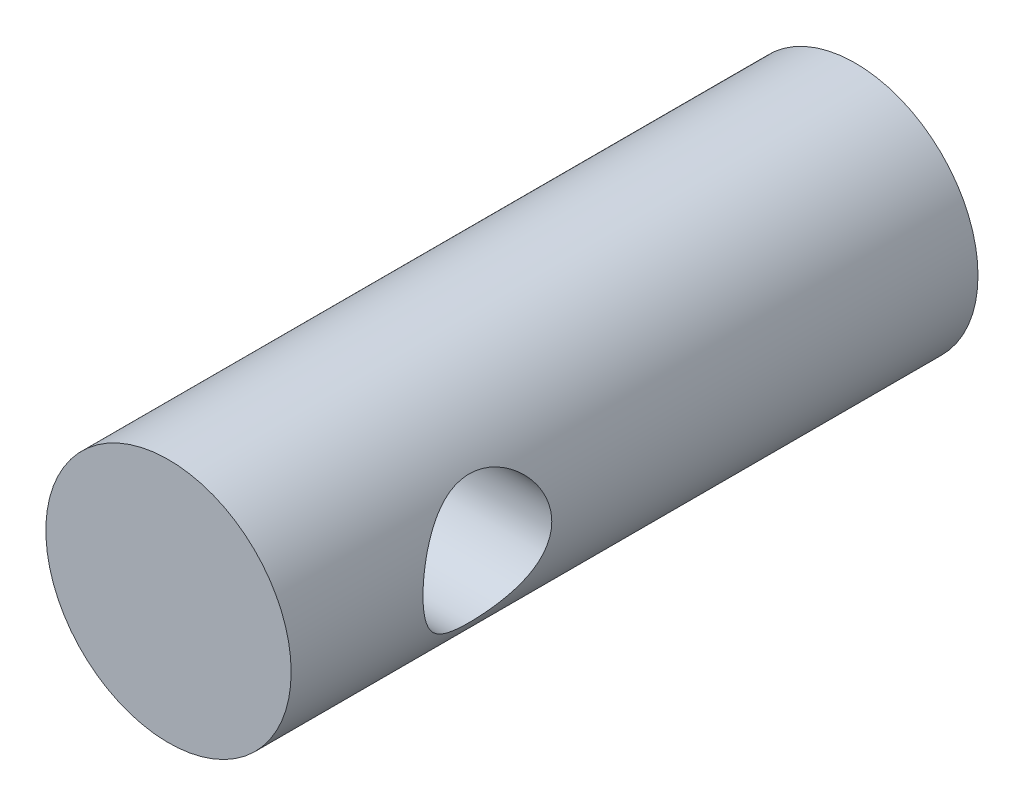
ISO-10303-21;
HEADER;
FILE_DESCRIPTION(('STEP AP214'),'2;1');
FILE_NAME('part.step','',(''),(''),'','','');
FILE_SCHEMA(('AUTOMOTIVE_DESIGN { 1 0 10303 214 1 1 1 1 }'));
ENDSEC;
DATA;
#1=APPLICATION_CONTEXT('core data for automotive mechanical design processes');
#2=APPLICATION_PROTOCOL_DEFINITION('international standard','automotive_design',2000,#1);
#3=PRODUCT_CONTEXT('',#1,'mechanical');
#4=PRODUCT('Part','Part','',(#3));
#5=PRODUCT_RELATED_PRODUCT_CATEGORY('part','',(#4));
#6=PRODUCT_DEFINITION_FORMATION('','',#4);
#7=PRODUCT_DEFINITION_CONTEXT('part definition',#1,'design');
#8=PRODUCT_DEFINITION('design','',#6,#7);
#9=PRODUCT_DEFINITION_SHAPE('','',#8);
#10=(LENGTH_UNIT() NAMED_UNIT(*) SI_UNIT(.MILLI.,.METRE.));
#11=(NAMED_UNIT(*) PLANE_ANGLE_UNIT() SI_UNIT($,.RADIAN.));
#12=(NAMED_UNIT(*) SI_UNIT($,.STERADIAN.) SOLID_ANGLE_UNIT());
#13=UNCERTAINTY_MEASURE_WITH_UNIT(LENGTH_MEASURE(1.E-05),#10,'distance_accuracy_value','');
#14=(GEOMETRIC_REPRESENTATION_CONTEXT(3) GLOBAL_UNCERTAINTY_ASSIGNED_CONTEXT((#13)) GLOBAL_UNIT_ASSIGNED_CONTEXT((#10,
#11,#12)) REPRESENTATION_CONTEXT('',''));
#15=CARTESIAN_POINT('',(0.,0.,0.));
#16=DIRECTION('',(0.,0.,1.));
#17=DIRECTION('',(1.,0.,0.));
#18=AXIS2_PLACEMENT_3D('',#15,#16,#17);
#19=CARTESIAN_POINT('',(0.,0.,56.));
#20=DIRECTION('',(0.,0.,-1.));
#21=DIRECTION('',(-1.,0.,0.));
#22=AXIS2_PLACEMENT_3D('',#19,#20,#21);
#23=CYLINDRICAL_SURFACE('',#22,10.);
#24=CARTESIAN_POINT('',(-10.,0.,34.75));
#25=CARTESIAN_POINT('',(-10.0000002272335,0.137219280547153,34.7499997154595));
#26=CARTESIAN_POINT('',(-9.9971695390607,0.274435419117508,34.755385393669));
#27=CARTESIAN_POINT('',(-9.9859196341468,0.54784622232378,34.7768616046407));
#28=CARTESIAN_POINT('',(-9.97749836499467,0.684040493235205,34.7929560688115));
#29=CARTESIAN_POINT('',(-9.95526954825004,0.954484268200272,34.8356777412984));
#30=CARTESIAN_POINT('',(-9.94145555844572,1.08873124630636,34.8623175477479));
#31=CARTESIAN_POINT('',(-9.90878502481806,1.35420731073398,34.9258240899162));
#32=CARTESIAN_POINT('',(-9.88992642039346,1.48543513996532,34.962695005022));
#33=CARTESIAN_POINT('',(-9.84772073139797,1.74338589936232,35.046073083859));
#34=CARTESIAN_POINT('',(-9.82439408650479,1.87012634391848,35.0925364382152));
#35=CARTESIAN_POINT('',(-9.77374047241918,2.11899910335565,35.1947462189268));
#36=CARTESIAN_POINT('',(-9.74641199440784,2.24112965821981,35.2504961477127));
#37=CARTESIAN_POINT('',(-9.65934198911403,2.59949324496559,35.4309132717361));
#38=CARTESIAN_POINT('',(-9.59447028649095,2.82796520762876,35.5688350922405));
#39=CARTESIAN_POINT('',(-9.45204211778156,3.27372275797712,35.8860077601745));
#40=CARTESIAN_POINT('',(-9.37393643487358,3.48932750449225,36.0673556333996));
#41=CARTESIAN_POINT('',(-9.21545596865336,3.8886458044364,36.4616665170357));
#42=CARTESIAN_POINT('',(-9.13507933066736,4.07233236069242,36.6746560109919));
#43=CARTESIAN_POINT('',(-8.97292923888063,4.41885642960393,37.1487519373176));
#44=CARTESIAN_POINT('',(-8.89165111021945,4.57845425792897,37.4124397440573));
#45=CARTESIAN_POINT('',(-8.78267726364413,4.78231536149079,37.8283924336076));
#46=CARTESIAN_POINT('',(-8.74850075709138,4.84436102124095,37.9704969611813));
#47=CARTESIAN_POINT('',(-8.68577293511994,4.95595024092318,38.2606969657031));
#48=CARTESIAN_POINT('',(-8.65721813970726,5.00550154057646,38.4087886675475));
#49=CARTESIAN_POINT('',(-8.60851077322864,5.08878465482482,38.7006270489237));
#50=CARTESIAN_POINT('',(-8.587949845536,5.12330119908315,38.8440819005548));
#51=CARTESIAN_POINT('',(-8.55374369431526,5.18020997914698,39.1341225070938));
#52=CARTESIAN_POINT('',(-8.54009461148356,5.20260898139194,39.2807064670717));
#53=CARTESIAN_POINT('',(-8.52032581020631,5.23492209789572,39.5756393104749));
#54=CARTESIAN_POINT('',(-8.51420036499284,5.24484570818525,39.7239867646259));
#55=CARTESIAN_POINT('',(-8.50975281069957,5.25205946869656,40.0210981336327));
#56=CARTESIAN_POINT('',(-8.51142981115412,5.24935106056601,40.1698619990285));
#57=CARTESIAN_POINT('',(-8.5217479943958,5.23257907023163,40.4462087194657));
#58=CARTESIAN_POINT('',(-8.52941410986322,5.22010486854873,40.573928632525));
#59=CARTESIAN_POINT('',(-8.55024031855141,5.18592245284569,40.8277116165171));
#60=CARTESIAN_POINT('',(-8.56340211154436,5.16421138189128,40.9537741623849));
#61=CARTESIAN_POINT('',(-8.59478129237691,5.11181617148469,41.2033669370168));
#62=CARTESIAN_POINT('',(-8.61299832215874,5.08113266753343,41.3268973444647));
#63=CARTESIAN_POINT('',(-8.65391561205325,5.01112590957965,41.5707425278666));
#64=CARTESIAN_POINT('',(-8.67661764578175,4.97179923690137,41.6910560102334));
#65=CARTESIAN_POINT('',(-8.75158613496986,4.83944266050791,42.0515073680498));
#66=CARTESIAN_POINT('',(-8.80998221055457,4.73319719507349,42.2856677921991));
#67=CARTESIAN_POINT('',(-8.93673383412095,4.48927913110239,42.7338870236354));
#68=CARTESIAN_POINT('',(-9.00509382533886,4.35159249631468,42.9479367925207));
#69=CARTESIAN_POINT('',(-9.15575739072049,4.02599923880666,43.3819321977086));
#70=CARTESIAN_POINT('',(-9.23866411313319,3.83374090515359,43.5984147440292));
#71=CARTESIAN_POINT('',(-9.40135838816874,3.41536670121867,43.9976657471951));
#72=CARTESIAN_POINT('',(-9.48114412592955,3.18923148995554,44.1804148110167));
#73=CARTESIAN_POINT('',(-9.5946956252551,2.821282740588,44.4301866023678));
#74=CARTESIAN_POINT('',(-9.63242744398394,2.68996216013096,44.5111565993821));
#75=CARTESIAN_POINT('',(-9.70379978677849,2.41986332749827,44.6616119853832));
#76=CARTESIAN_POINT('',(-9.73744204764833,2.28108827753964,44.7311022542564));
#77=CARTESIAN_POINT('',(-9.79964224031448,1.99703485726557,44.8578321211375));
#78=CARTESIAN_POINT('',(-9.82820247889613,1.85175947518982,44.9150772797319));
#79=CARTESIAN_POINT('',(-9.87938315597843,1.55574231468487,45.0166361451983));
#80=CARTESIAN_POINT('',(-9.90200435691644,1.40500124075675,45.060951512043));
#81=CARTESIAN_POINT('',(-9.93888050639706,1.11282934307187,45.1327093015454));
#82=CARTESIAN_POINT('',(-9.95369724432438,0.971749460230002,45.1612948917491));
#83=CARTESIAN_POINT('',(-9.97737832564566,0.68723415207172,45.2068184069805));
#84=CARTESIAN_POINT('',(-9.98624326965873,0.543798965935316,45.2237575073056));
#85=CARTESIAN_POINT('',(-9.9977649691323,0.255835151509784,45.2457498967185));
#86=CARTESIAN_POINT('',(-10.0004244577754,0.111307032752616,45.2508084185937));
#87=CARTESIAN_POINT('',(-9.99946551039621,-0.177649036404392,45.2489819954514));
#88=CARTESIAN_POINT('',(-9.99584741118279,-0.322076991762344,45.2420976911974));
#89=CARTESIAN_POINT('',(-9.98302883233932,-0.59697762790255,45.2176105990903));
#90=CARTESIAN_POINT('',(-9.97434520954031,-0.72756434672015,45.2009997244619));
#91=CARTESIAN_POINT('',(-9.95204728968371,-0.986752417901725,45.1581082503083));
#92=CARTESIAN_POINT('',(-9.93843144599325,-1.11535313429704,45.1318246175838));
#93=CARTESIAN_POINT('',(-9.90658705292847,-1.36965004237689,45.0698791233916));
#94=CARTESIAN_POINT('',(-9.88835994251531,-1.4953471268205,45.0342201873826));
#95=CARTESIAN_POINT('',(-9.84770291270563,-1.74314372577149,44.9538815850797));
#96=CARTESIAN_POINT('',(-9.82527138093231,-1.86524183923142,44.9091984575375));
#97=CARTESIAN_POINT('',(-9.75112230193065,-2.23123711650007,44.759683174281));
#98=CARTESIAN_POINT('',(-9.69338463506806,-2.46841439744368,44.6409566149505));
#99=CARTESIAN_POINT('',(-9.56704734835907,-2.92006961741365,44.3709377560504));
#100=CARTESIAN_POINT('',(-9.49844337518584,-3.13453840111886,44.2196323957913));
#101=CARTESIAN_POINT('',(-9.34827580923662,-3.55886678955075,43.8704284200232));
#102=CARTESIAN_POINT('',(-9.26610842953409,-3.76585720791016,43.6692995116939));
#103=CARTESIAN_POINT('',(-9.10299232838763,-4.14465083180736,43.2353266561333));
#104=CARTESIAN_POINT('',(-9.02204471969024,-4.31642352057215,43.0024554921054));
#105=CARTESIAN_POINT('',(-8.90577435633367,-4.54921678298437,42.6250435109724));
#106=CARTESIAN_POINT('',(-8.86683357688885,-4.6244388087147,42.4901896992906));
#107=CARTESIAN_POINT('',(-8.7931345699769,-4.76308083496289,42.2134764201175));
#108=CARTESIAN_POINT('',(-8.75837445370803,-4.82650617229413,42.0716201574651));
#109=CARTESIAN_POINT('',(-8.69440356931228,-4.94081379482617,41.7818796380876));
#110=CARTESIAN_POINT('',(-8.66518784171106,-4.99170730203359,41.6340009136928));
#111=CARTESIAN_POINT('',(-8.61353453429228,-5.08032094735002,41.3331942178638));
#112=CARTESIAN_POINT('',(-8.5910957836759,-5.11804336108919,41.1802671236621));
#113=CARTESIAN_POINT('',(-8.55587841408529,-5.17667803179201,40.885876370402));
#114=CARTESIAN_POINT('',(-8.54236940354325,-5.19887396728424,40.7447551992555));
#115=CARTESIAN_POINT('',(-8.52230458141237,-5.23170136755015,40.4606900239805));
#116=CARTESIAN_POINT('',(-8.51574786721988,-5.24233433352714,40.3177462589152));
#117=CARTESIAN_POINT('',(-8.50987680634924,-5.25185951233148,40.0313891440474));
#118=CARTESIAN_POINT('',(-8.510558925294,-5.25075745481041,39.8879760575833));
#119=CARTESIAN_POINT('',(-8.51912638319486,-5.23684562254051,39.601943858486));
#120=CARTESIAN_POINT('',(-8.5270112990325,-5.2240365355051,39.4593246997096));
#121=CARTESIAN_POINT('',(-8.54833517431969,-5.18905861916021,39.1924473580568));
#122=CARTESIAN_POINT('',(-8.5610310262324,-5.16813575164992,39.0679640258113));
#123=CARTESIAN_POINT('',(-8.59136907943889,-5.11754218486671,38.8213892965296));
#124=CARTESIAN_POINT('',(-8.60901278368162,-5.0878688274224,38.6992986383617));
#125=CARTESIAN_POINT('',(-8.66858187281142,-4.98617367311396,38.3377253109075));
#126=CARTESIAN_POINT('',(-8.71715897973572,-4.90145556802352,38.1027828076761));
#127=CARTESIAN_POINT('',(-8.83039079036659,-4.69456138578904,37.6349714407805));
#128=CARTESIAN_POINT('',(-8.89589043768955,-4.57029454343953,37.4032472724666));
#129=CARTESIAN_POINT('',(-9.03443201618363,-4.28992761428728,36.9623527301252));
#130=CARTESIAN_POINT('',(-9.10747799349605,-4.13381040597986,36.7531945795452));
#131=CARTESIAN_POINT('',(-9.26498416164772,-3.76892931535454,36.3331943827232));
#132=CARTESIAN_POINT('',(-9.34962231131358,-3.55586671949328,36.1261422242755));
#133=CARTESIAN_POINT('',(-9.51181668814185,-3.09590888201791,35.7495805054818));
#134=CARTESIAN_POINT('',(-9.58936853521663,-2.84899294804857,35.5800940737121));
#135=CARTESIAN_POINT('',(-9.69497778028643,-2.454898458479,35.3567835216522));
#136=CARTESIAN_POINT('',(-9.72867771558497,-2.31807696854076,35.2869586700024));
#137=CARTESIAN_POINT('',(-9.79118868583265,-2.0379321820102,35.1592366263681));
#138=CARTESIAN_POINT('',(-9.82000212708188,-1.89461212988961,35.1013335606071));
#139=CARTESIAN_POINT('',(-9.87182740549181,-1.60279401104823,34.998254813738));
#140=CARTESIAN_POINT('',(-9.89485117247651,-1.4543073215953,34.9530529384303));
#141=CARTESIAN_POINT('',(-9.93444682087441,-1.15317060054866,34.8758576948909));
#142=CARTESIAN_POINT('',(-9.95102237408543,-1.00052299145191,34.8438568090083));
#143=CARTESIAN_POINT('',(-9.9759631073553,-0.706948892559233,34.7958943872746));
#144=CARTESIAN_POINT('',(-9.98495530017709,-0.566275097942625,34.7787045688214));
#145=CARTESIAN_POINT('',(-9.99697368746327,-0.283733098336373,34.7557574103087));
#146=CARTESIAN_POINT('',(-9.99999976507347,-0.14186487000683,34.7500002941737));
#147=CARTESIAN_POINT('',(-10.,0.,34.75));
#148=B_SPLINE_CURVE_WITH_KNOTS('',3,(#24,#25,#26,#27,#28,#29,#30,#31,#32,#33,#34,#35,#36,#37,
#38,#39,#40,#41,#42,#43,#44,#45,#46,#47,#48,#49,#50,#51,#52,#53,#54,#55,#56,#57,#58,#59,#60,#61,
#62,#63,#64,#65,#66,#67,#68,#69,#70,#71,#72,#73,#74,#75,#76,#77,#78,#79,#80,#81,#82,#83,#84,#85,
#86,#87,#88,#89,#90,#91,#92,#93,#94,#95,#96,#97,#98,#99,#100,#101,#102,#103,#104,#105,#106,#107,
#108,#109,#110,#111,#112,#113,#114,#115,#116,#117,#118,#119,#120,#121,#122,#123,#124,#125,#126,
#127,#128,#129,#130,#131,#132,#133,#134,#135,#136,#137,#138,#139,#140,#141,#142,#143,#144,#145,
#146,#147),.UNSPECIFIED.,.T.,.F.,(4,2,2,2,2,2,2,2,2,2,2,2,2,2,2,2,2,2,2,2,2,2,2,2,2,2,2,2,2,2,2,
2,2,2,2,2,2,2,2,2,2,2,2,2,2,2,2,2,2,2,2,2,2,2,2,2,2,2,2,2,2,4),(0.,0.41151854593316,
0.823188251936375,1.23535125612146,1.6476828765493,2.05817143133695,2.46881515382124,
3.28925857265437,4.16279834004598,5.03707340942755,5.98799664373627,6.4637715390355,
6.93925098407662,7.38552525893881,7.83155007620076,8.27723518189659,8.72286942436893,
9.1080823559605,9.49341451940306,9.87871939708549,10.2641769514919,11.0518764559294,
11.8399283021686,12.7396564856037,13.6399003132389,14.1158328503485,14.591562551084,
15.067075758997,15.542527891946,15.9760601737939,16.4095486996026,16.8428462600368,
17.2761205736583,17.6714347685003,18.0668730323905,18.4621880503312,18.8576549811517,
19.6683496017933,20.4793698332679,21.3758847965833,22.2731733526402,22.750383935953,
23.2273781016115,23.7039435622231,24.1804266436458,24.6102867369871,25.0400910155598,
25.4696854508541,25.899254651833,26.2794167182899,26.6596943872714,27.4197738215506,
28.2296595066907,29.0399817071355,29.9626916334695,30.8859680881548,31.3572036982906,
31.8282065755557,32.298230832392,32.7679870507956,33.1934293164578,33.6188799148826),.UNSPECIFIED.);
#149=CARTESIAN_POINT('',(-10.,0.,34.75));
#150=VERTEX_POINT('',#149);
#151=EDGE_CURVE('E10',#150,#150,#148,.T.);
#152=ORIENTED_EDGE('',*,*,#151,.T.);
#153=EDGE_LOOP('',(#152));
#154=FACE_BOUND('',#153,.T.);
#155=CARTESIAN_POINT('',(10.,0.,34.75));
#156=CARTESIAN_POINT('',(10.0000002272335,-0.137219280547153,34.7499997154595));
#157=CARTESIAN_POINT('',(9.9971695390607,-0.274435419117508,34.755385393669));
#158=CARTESIAN_POINT('',(9.9859196341468,-0.54784622232378,34.7768616046407));
#159=CARTESIAN_POINT('',(9.97749836499467,-0.684040493235205,34.7929560688115));
#160=CARTESIAN_POINT('',(9.95526954825004,-0.954484268200272,34.8356777412984));
#161=CARTESIAN_POINT('',(9.94145555844572,-1.08873124630636,34.8623175477479));
#162=CARTESIAN_POINT('',(9.90878502481806,-1.35420731073398,34.9258240899162));
#163=CARTESIAN_POINT('',(9.88992642039346,-1.48543513996532,34.962695005022));
#164=CARTESIAN_POINT('',(9.84772073139797,-1.74338589936232,35.046073083859));
#165=CARTESIAN_POINT('',(9.82439408650479,-1.87012634391848,35.0925364382152));
#166=CARTESIAN_POINT('',(9.77374047241918,-2.11899910335565,35.1947462189268));
#167=CARTESIAN_POINT('',(9.74641199440784,-2.24112965821981,35.2504961477127));
#168=CARTESIAN_POINT('',(9.65934198911403,-2.59949324496559,35.4309132717361));
#169=CARTESIAN_POINT('',(9.59447028649095,-2.82796520762876,35.5688350922405));
#170=CARTESIAN_POINT('',(9.45204211778156,-3.27372275797712,35.8860077601745));
#171=CARTESIAN_POINT('',(9.37393643487358,-3.48932750449225,36.0673556333996));
#172=CARTESIAN_POINT('',(9.21545596865336,-3.8886458044364,36.4616665170357));
#173=CARTESIAN_POINT('',(9.13507933066736,-4.07233236069242,36.6746560109919));
#174=CARTESIAN_POINT('',(8.97292923888063,-4.41885642960393,37.1487519373176));
#175=CARTESIAN_POINT('',(8.89165111021945,-4.57845425792897,37.4124397440573));
#176=CARTESIAN_POINT('',(8.78267726364413,-4.78231536149079,37.8283924336076));
#177=CARTESIAN_POINT('',(8.74850075709138,-4.84436102124095,37.9704969611813));
#178=CARTESIAN_POINT('',(8.68577293511994,-4.95595024092318,38.2606969657031));
#179=CARTESIAN_POINT('',(8.65721813970726,-5.00550154057646,38.4087886675475));
#180=CARTESIAN_POINT('',(8.60851077322864,-5.08878465482482,38.7006270489237));
#181=CARTESIAN_POINT('',(8.587949845536,-5.12330119908315,38.8440819005548));
#182=CARTESIAN_POINT('',(8.55374369431526,-5.18020997914698,39.1341225070938));
#183=CARTESIAN_POINT('',(8.54009461148356,-5.20260898139194,39.2807064670717));
#184=CARTESIAN_POINT('',(8.52032581020631,-5.23492209789572,39.5756393104749));
#185=CARTESIAN_POINT('',(8.51420036499284,-5.24484570818525,39.7239867646259));
#186=CARTESIAN_POINT('',(8.50975281069957,-5.25205946869656,40.0210981336327));
#187=CARTESIAN_POINT('',(8.51142981115412,-5.24935106056601,40.1698619990285));
#188=CARTESIAN_POINT('',(8.5217479943958,-5.23257907023163,40.4462087194657));
#189=CARTESIAN_POINT('',(8.52941410986322,-5.22010486854873,40.573928632525));
#190=CARTESIAN_POINT('',(8.55024031855141,-5.18592245284569,40.8277116165171));
#191=CARTESIAN_POINT('',(8.56340211154436,-5.16421138189128,40.9537741623849));
#192=CARTESIAN_POINT('',(8.59478129237691,-5.11181617148469,41.2033669370168));
#193=CARTESIAN_POINT('',(8.61299832215874,-5.08113266753343,41.3268973444647));
#194=CARTESIAN_POINT('',(8.65391561205325,-5.01112590957965,41.5707425278666));
#195=CARTESIAN_POINT('',(8.67661764578175,-4.97179923690137,41.6910560102334));
#196=CARTESIAN_POINT('',(8.75158613496986,-4.83944266050791,42.0515073680498));
#197=CARTESIAN_POINT('',(8.80998221055457,-4.73319719507349,42.2856677921991));
#198=CARTESIAN_POINT('',(8.93673383412095,-4.48927913110239,42.7338870236354));
#199=CARTESIAN_POINT('',(9.00509382533886,-4.35159249631468,42.9479367925207));
#200=CARTESIAN_POINT('',(9.15575739072049,-4.02599923880666,43.3819321977086));
#201=CARTESIAN_POINT('',(9.23866411313319,-3.83374090515359,43.5984147440292));
#202=CARTESIAN_POINT('',(9.40135838816874,-3.41536670121867,43.9976657471951));
#203=CARTESIAN_POINT('',(9.48114412592955,-3.18923148995554,44.1804148110167));
#204=CARTESIAN_POINT('',(9.5946956252551,-2.821282740588,44.4301866023678));
#205=CARTESIAN_POINT('',(9.63242744398394,-2.68996216013096,44.5111565993821));
#206=CARTESIAN_POINT('',(9.70379978677849,-2.41986332749827,44.6616119853832));
#207=CARTESIAN_POINT('',(9.73744204764833,-2.28108827753964,44.7311022542564));
#208=CARTESIAN_POINT('',(9.79964224031448,-1.99703485726557,44.8578321211375));
#209=CARTESIAN_POINT('',(9.82820247889613,-1.85175947518982,44.9150772797319));
#210=CARTESIAN_POINT('',(9.87938315597843,-1.55574231468487,45.0166361451983));
#211=CARTESIAN_POINT('',(9.90200435691644,-1.40500124075675,45.060951512043));
#212=CARTESIAN_POINT('',(9.93888050639706,-1.11282934307187,45.1327093015454));
#213=CARTESIAN_POINT('',(9.95369724432438,-0.971749460230002,45.1612948917491));
#214=CARTESIAN_POINT('',(9.97737832564566,-0.68723415207172,45.2068184069805));
#215=CARTESIAN_POINT('',(9.98624326965873,-0.543798965935316,45.2237575073056));
#216=CARTESIAN_POINT('',(9.9977649691323,-0.255835151509784,45.2457498967185));
#217=CARTESIAN_POINT('',(10.0004244577754,-0.111307032752616,45.2508084185937));
#218=CARTESIAN_POINT('',(9.99946551039621,0.177649036404392,45.2489819954514));
#219=CARTESIAN_POINT('',(9.99584741118279,0.322076991762344,45.2420976911974));
#220=CARTESIAN_POINT('',(9.98302883233932,0.59697762790255,45.2176105990903));
#221=CARTESIAN_POINT('',(9.97434520954031,0.72756434672015,45.2009997244619));
#222=CARTESIAN_POINT('',(9.95204728968371,0.986752417901725,45.1581082503083));
#223=CARTESIAN_POINT('',(9.93843144599325,1.11535313429704,45.1318246175838));
#224=CARTESIAN_POINT('',(9.90658705292847,1.36965004237689,45.0698791233916));
#225=CARTESIAN_POINT('',(9.88835994251531,1.4953471268205,45.0342201873826));
#226=CARTESIAN_POINT('',(9.84770291270563,1.74314372577149,44.9538815850797));
#227=CARTESIAN_POINT('',(9.82527138093231,1.86524183923142,44.9091984575375));
#228=CARTESIAN_POINT('',(9.75112230193065,2.23123711650007,44.759683174281));
#229=CARTESIAN_POINT('',(9.69338463506806,2.46841439744368,44.6409566149505));
#230=CARTESIAN_POINT('',(9.56704734835907,2.92006961741365,44.3709377560504));
#231=CARTESIAN_POINT('',(9.49844337518584,3.13453840111886,44.2196323957913));
#232=CARTESIAN_POINT('',(9.34827580923662,3.55886678955075,43.8704284200232));
#233=CARTESIAN_POINT('',(9.26610842953409,3.76585720791016,43.6692995116939));
#234=CARTESIAN_POINT('',(9.10299232838763,4.14465083180736,43.2353266561333));
#235=CARTESIAN_POINT('',(9.02204471969024,4.31642352057215,43.0024554921054));
#236=CARTESIAN_POINT('',(8.90577435633367,4.54921678298437,42.6250435109724));
#237=CARTESIAN_POINT('',(8.86683357688885,4.6244388087147,42.4901896992906));
#238=CARTESIAN_POINT('',(8.7931345699769,4.76308083496289,42.2134764201175));
#239=CARTESIAN_POINT('',(8.75837445370803,4.82650617229413,42.0716201574651));
#240=CARTESIAN_POINT('',(8.69440356931228,4.94081379482617,41.7818796380876));
#241=CARTESIAN_POINT('',(8.66518784171106,4.99170730203359,41.6340009136928));
#242=CARTESIAN_POINT('',(8.61353453429228,5.08032094735002,41.3331942178638));
#243=CARTESIAN_POINT('',(8.5910957836759,5.11804336108919,41.1802671236621));
#244=CARTESIAN_POINT('',(8.55587841408529,5.17667803179201,40.885876370402));
#245=CARTESIAN_POINT('',(8.54236940354325,5.19887396728424,40.7447551992555));
#246=CARTESIAN_POINT('',(8.52230458141237,5.23170136755015,40.4606900239805));
#247=CARTESIAN_POINT('',(8.51574786721988,5.24233433352714,40.3177462589152));
#248=CARTESIAN_POINT('',(8.50987680634924,5.25185951233148,40.0313891440474));
#249=CARTESIAN_POINT('',(8.510558925294,5.25075745481041,39.8879760575833));
#250=CARTESIAN_POINT('',(8.51912638319486,5.23684562254051,39.601943858486));
#251=CARTESIAN_POINT('',(8.5270112990325,5.2240365355051,39.4593246997096));
#252=CARTESIAN_POINT('',(8.54833517431969,5.18905861916021,39.1924473580568));
#253=CARTESIAN_POINT('',(8.5610310262324,5.16813575164992,39.0679640258113));
#254=CARTESIAN_POINT('',(8.59136907943889,5.11754218486671,38.8213892965296));
#255=CARTESIAN_POINT('',(8.60901278368162,5.0878688274224,38.6992986383617));
#256=CARTESIAN_POINT('',(8.66858187281142,4.98617367311396,38.3377253109075));
#257=CARTESIAN_POINT('',(8.71715897973572,4.90145556802352,38.1027828076761));
#258=CARTESIAN_POINT('',(8.83039079036659,4.69456138578904,37.6349714407805));
#259=CARTESIAN_POINT('',(8.89589043768955,4.57029454343953,37.4032472724666));
#260=CARTESIAN_POINT('',(9.03443201618363,4.28992761428728,36.9623527301252));
#261=CARTESIAN_POINT('',(9.10747799349605,4.13381040597986,36.7531945795452));
#262=CARTESIAN_POINT('',(9.26498416164772,3.76892931535454,36.3331943827232));
#263=CARTESIAN_POINT('',(9.34962231131358,3.55586671949328,36.1261422242755));
#264=CARTESIAN_POINT('',(9.51181668814185,3.09590888201791,35.7495805054818));
#265=CARTESIAN_POINT('',(9.58936853521663,2.84899294804857,35.5800940737121));
#266=CARTESIAN_POINT('',(9.69497778028643,2.454898458479,35.3567835216522));
#267=CARTESIAN_POINT('',(9.72867771558497,2.31807696854076,35.2869586700024));
#268=CARTESIAN_POINT('',(9.79118868583265,2.0379321820102,35.1592366263681));
#269=CARTESIAN_POINT('',(9.82000212708188,1.89461212988961,35.1013335606071));
#270=CARTESIAN_POINT('',(9.87182740549181,1.60279401104823,34.998254813738));
#271=CARTESIAN_POINT('',(9.89485117247651,1.4543073215953,34.9530529384303));
#272=CARTESIAN_POINT('',(9.93444682087441,1.15317060054866,34.8758576948909));
#273=CARTESIAN_POINT('',(9.95102237408543,1.00052299145191,34.8438568090083));
#274=CARTESIAN_POINT('',(9.9759631073553,0.706948892559233,34.7958943872746));
#275=CARTESIAN_POINT('',(9.98495530017709,0.566275097942625,34.7787045688214));
#276=CARTESIAN_POINT('',(9.99697368746327,0.283733098336373,34.7557574103087));
#277=CARTESIAN_POINT('',(9.99999976507347,0.14186487000683,34.7500002941737));
#278=CARTESIAN_POINT('',(10.,0.,34.75));
#279=B_SPLINE_CURVE_WITH_KNOTS('',3,(#155,#156,#157,#158,#159,#160,#161,#162,#163,#164,#165,
#166,#167,#168,#169,#170,#171,#172,#173,#174,#175,#176,#177,#178,#179,#180,#181,#182,#183,#184,
#185,#186,#187,#188,#189,#190,#191,#192,#193,#194,#195,#196,#197,#198,#199,#200,#201,#202,#203,
#204,#205,#206,#207,#208,#209,#210,#211,#212,#213,#214,#215,#216,#217,#218,#219,#220,#221,#222,
#223,#224,#225,#226,#227,#228,#229,#230,#231,#232,#233,#234,#235,#236,#237,#238,#239,#240,#241,
#242,#243,#244,#245,#246,#247,#248,#249,#250,#251,#252,#253,#254,#255,#256,#257,#258,#259,#260,
#261,#262,#263,#264,#265,#266,#267,#268,#269,#270,#271,#272,#273,#274,#275,#276,#277,#278),
.UNSPECIFIED.,.T.,.F.,(4,2,2,2,2,2,2,2,2,2,2,2,2,2,2,2,2,2,2,2,2,2,2,2,2,2,2,2,2,2,2,2,2,2,2,2,
2,2,2,2,2,2,2,2,2,2,2,2,2,2,2,2,2,2,2,2,2,2,2,2,2,4),(0.,0.41151854593316,0.823188251936375,
1.23535125612146,1.6476828765493,2.05817143133695,2.46881515382124,3.28925857265437,
4.16279834004598,5.03707340942755,5.98799664373627,6.4637715390355,6.93925098407662,
7.38552525893881,7.83155007620076,8.27723518189659,8.72286942436893,9.1080823559605,
9.49341451940306,9.87871939708549,10.2641769514919,11.0518764559294,11.8399283021686,
12.7396564856037,13.6399003132389,14.1158328503485,14.591562551084,15.067075758997,
15.542527891946,15.9760601737939,16.4095486996026,16.8428462600368,17.2761205736583,
17.6714347685003,18.0668730323905,18.4621880503312,18.8576549811517,19.6683496017933,
20.4793698332679,21.3758847965833,22.2731733526402,22.750383935953,23.2273781016115,
23.7039435622231,24.1804266436458,24.6102867369871,25.0400910155598,25.4696854508541,
25.899254651833,26.2794167182899,26.6596943872714,27.4197738215506,28.2296595066907,
29.0399817071355,29.9626916334695,30.8859680881548,31.3572036982906,31.8282065755557,
32.298230832392,32.7679870507956,33.1934293164578,33.6188799148826),.UNSPECIFIED.);
#280=CARTESIAN_POINT('',(10.,0.,34.75));
#281=VERTEX_POINT('',#280);
#282=EDGE_CURVE('E55',#281,#281,#279,.T.);
#283=ORIENTED_EDGE('',*,*,#282,.T.);
#284=EDGE_LOOP('',(#283));
#285=FACE_BOUND('',#284,.T.);
#286=CARTESIAN_POINT('',(0.,0.,56.));
#287=DIRECTION('',(0.,0.,1.));
#288=DIRECTION('',(1.,0.,0.));
#289=AXIS2_PLACEMENT_3D('',#286,#287,#288);
#290=CIRCLE('',#289,10.);
#291=CARTESIAN_POINT('',(10.,0.,56.));
#292=VERTEX_POINT('',#291);
#293=EDGE_CURVE('E60',#292,#292,#290,.T.);
#294=ORIENTED_EDGE('',*,*,#293,.F.);
#295=EDGE_LOOP('',(#294));
#296=FACE_BOUND('',#295,.T.);
#297=CARTESIAN_POINT('',(0.,0.,0.));
#298=DIRECTION('',(0.,0.,1.));
#299=DIRECTION('',(1.,0.,0.));
#300=AXIS2_PLACEMENT_3D('',#297,#298,#299);
#301=CIRCLE('',#300,10.);
#302=CARTESIAN_POINT('',(10.,0.,0.));
#303=VERTEX_POINT('',#302);
#304=EDGE_CURVE('E65',#303,#303,#301,.T.);
#305=ORIENTED_EDGE('',*,*,#304,.T.);
#306=EDGE_LOOP('',(#305));
#307=FACE_BOUND('',#306,.T.);
#308=ADVANCED_FACE('F43',(#154,#285,#296,#307),#23,.T.);
#309=CARTESIAN_POINT('',(0.,0.,56.));
#310=DIRECTION('',(0.,0.,1.));
#311=DIRECTION('',(1.,0.,0.));
#312=AXIS2_PLACEMENT_3D('',#309,#310,#311);
#313=PLANE('',#312);
#314=ORIENTED_EDGE('',*,*,#293,.T.);
#315=EDGE_LOOP('',(#314));
#316=FACE_BOUND('',#315,.T.);
#317=ADVANCED_FACE('F77',(#316),#313,.T.);
#318=CARTESIAN_POINT('',(0.,0.,0.));
#319=DIRECTION('',(0.,0.,1.));
#320=DIRECTION('',(1.,0.,0.));
#321=AXIS2_PLACEMENT_3D('',#318,#319,#320);
#322=PLANE('',#321);
#323=ORIENTED_EDGE('',*,*,#304,.F.);
#324=EDGE_LOOP('',(#323));
#325=FACE_BOUND('',#324,.T.);
#326=ADVANCED_FACE('F75',(#325),#322,.F.);
#327=CARTESIAN_POINT('',(-10.,0.,40.));
#328=DIRECTION('',(1.,0.,0.));
#329=DIRECTION('',(0.,0.,-1.));
#330=AXIS2_PLACEMENT_3D('',#327,#328,#329);
#331=CYLINDRICAL_SURFACE('',#330,5.25);
#332=ORIENTED_EDGE('',*,*,#282,.F.);
#333=EDGE_LOOP('',(#332));
#334=FACE_BOUND('',#333,.T.);
#335=ORIENTED_EDGE('',*,*,#151,.F.);
#336=EDGE_LOOP('',(#335));
#337=FACE_BOUND('',#336,.T.);
#338=ADVANCED_FACE('F71',(#334,#337),#331,.F.);
#339=CLOSED_SHELL('',(#308,#317,#326,#338));
#340=MANIFOLD_SOLID_BREP('B2',#339);
#341=ADVANCED_BREP_SHAPE_REPRESENTATION('',(#18,#340),#14);
#342=SHAPE_DEFINITION_REPRESENTATION(#9,#341);
ENDSEC;
END-ISO-10303-21;
